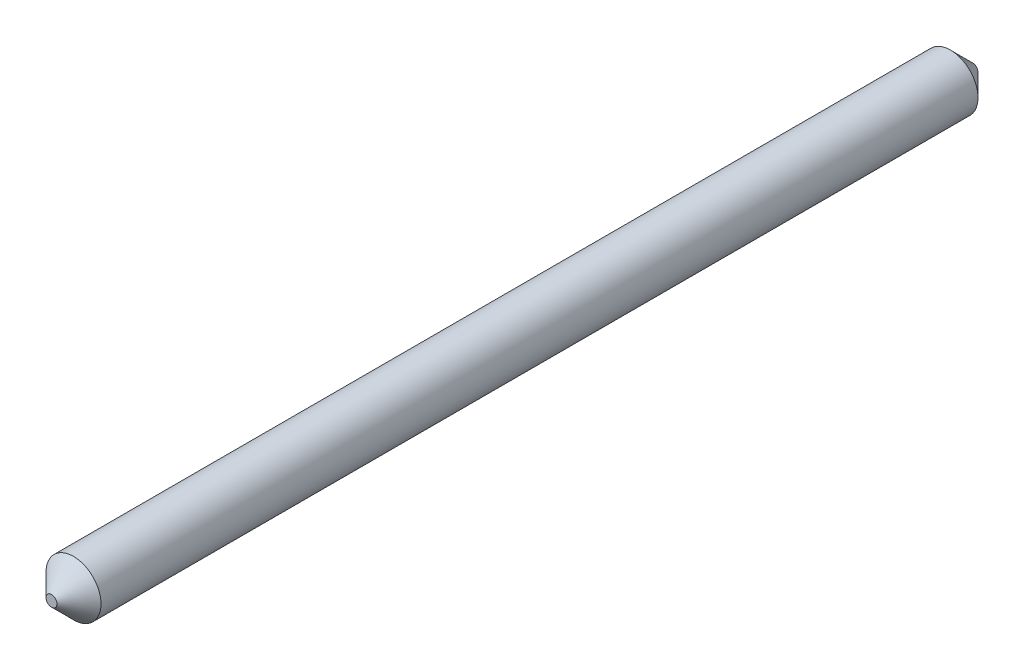
ISO-10303-21;
HEADER;
FILE_DESCRIPTION(('STEP AP214'),'2;1');
FILE_NAME('part.step','',(''),(''),'','','');
FILE_SCHEMA(('AUTOMOTIVE_DESIGN { 1 0 10303 214 1 1 1 1 }'));
ENDSEC;
DATA;
#1=APPLICATION_CONTEXT('core data for automotive mechanical design processes');
#2=APPLICATION_PROTOCOL_DEFINITION('international standard','automotive_design',2000,#1);
#3=PRODUCT_CONTEXT('',#1,'mechanical');
#4=PRODUCT('Part','Part','',(#3));
#5=PRODUCT_RELATED_PRODUCT_CATEGORY('part','',(#4));
#6=PRODUCT_DEFINITION_FORMATION('','',#4);
#7=PRODUCT_DEFINITION_CONTEXT('part definition',#1,'design');
#8=PRODUCT_DEFINITION('design','',#6,#7);
#9=PRODUCT_DEFINITION_SHAPE('','',#8);
#10=(LENGTH_UNIT() NAMED_UNIT(*) SI_UNIT(.MILLI.,.METRE.));
#11=(NAMED_UNIT(*) PLANE_ANGLE_UNIT() SI_UNIT($,.RADIAN.));
#12=(NAMED_UNIT(*) SI_UNIT($,.STERADIAN.) SOLID_ANGLE_UNIT());
#13=UNCERTAINTY_MEASURE_WITH_UNIT(LENGTH_MEASURE(1.E-05),#10,'distance_accuracy_value','');
#14=(GEOMETRIC_REPRESENTATION_CONTEXT(3) GLOBAL_UNCERTAINTY_ASSIGNED_CONTEXT((#13)) GLOBAL_UNIT_ASSIGNED_CONTEXT((#10,
#11,#12)) REPRESENTATION_CONTEXT('',''));
#15=CARTESIAN_POINT('',(0.,0.,0.));
#16=DIRECTION('',(0.,0.,1.));
#17=DIRECTION('',(1.,0.,0.));
#18=AXIS2_PLACEMENT_3D('',#15,#16,#17);
#19=CARTESIAN_POINT('',(0.,0.,4.52));
#20=DIRECTION('',(0.,0.,1.));
#21=DIRECTION('',(1.,0.,0.));
#22=AXIS2_PLACEMENT_3D('',#19,#20,#21);
#23=PLANE('',#22);
#24=CARTESIAN_POINT('',(0.,0.,4.52));
#25=DIRECTION('',(0.,0.,1.));
#26=DIRECTION('',(1.,0.,0.));
#27=AXIS2_PLACEMENT_3D('',#24,#25,#26);
#28=CIRCLE('',#27,0.046);
#29=CARTESIAN_POINT('',(0.046,0.,4.52));
#30=VERTEX_POINT('',#29);
#31=EDGE_CURVE('E11',#30,#30,#28,.T.);
#32=ORIENTED_EDGE('',*,*,#31,.T.);
#33=EDGE_LOOP('',(#32));
#34=FACE_BOUND('',#33,.T.);
#35=ADVANCED_FACE('F17',(#34),#23,.T.);
#36=CARTESIAN_POINT('',(0.,0.,-3.18));
#37=DIRECTION('',(0.,0.,1.));
#38=DIRECTION('',(1.,0.,0.));
#39=AXIS2_PLACEMENT_3D('',#36,#37,#38);
#40=PLANE('',#39);
#41=CARTESIAN_POINT('',(0.,0.,-3.18));
#42=DIRECTION('',(0.,0.,1.));
#43=DIRECTION('',(1.,0.,0.));
#44=AXIS2_PLACEMENT_3D('',#41,#42,#43);
#45=CIRCLE('',#44,0.046);
#46=CARTESIAN_POINT('',(0.046,0.,-3.18));
#47=VERTEX_POINT('',#46);
#48=EDGE_CURVE('E55',#47,#47,#45,.T.);
#49=ORIENTED_EDGE('',*,*,#48,.F.);
#50=EDGE_LOOP('',(#49));
#51=FACE_BOUND('',#50,.T.);
#52=ADVANCED_FACE('F82',(#51),#40,.F.);
#53=CARTESIAN_POINT('',(0.,0.,4.336));
#54=DIRECTION('',(0.,0.,-1.));
#55=DIRECTION('',(1.,0.,0.));
#56=AXIS2_PLACEMENT_3D('',#53,#54,#55);
#57=CONICAL_SURFACE('',#56,0.23,0.785398163397);
#58=DIRECTION('',(-0.707106781186548,0.,0.707106781186548));
#59=VECTOR('',#58,1.);
#60=CARTESIAN_POINT('',(0.23,0.,4.336));
#61=LINE('',#60,#59);
#62=CARTESIAN_POINT('',(0.23,0.,4.336));
#63=VERTEX_POINT('',#62);
#64=EDGE_CURVE('E25',#63,#30,#61,.T.);
#65=ORIENTED_EDGE('',*,*,#64,.F.);
#66=CARTESIAN_POINT('',(0.,0.,4.336));
#67=DIRECTION('',(0.,0.,1.));
#68=DIRECTION('',(1.,0.,0.));
#69=AXIS2_PLACEMENT_3D('',#66,#67,#68);
#70=CIRCLE('',#69,0.23);
#71=EDGE_CURVE('E64',#63,#63,#70,.T.);
#72=ORIENTED_EDGE('',*,*,#71,.T.);
#73=ORIENTED_EDGE('',*,*,#64,.T.);
#74=ORIENTED_EDGE('',*,*,#31,.F.);
#75=EDGE_LOOP('',(#65,#72,#73,#74));
#76=FACE_BOUND('',#75,.T.);
#77=ADVANCED_FACE('F80',(#76),#57,.T.);
#78=CARTESIAN_POINT('',(0.,0.,-2.996));
#79=DIRECTION('',(0.,0.,1.));
#80=DIRECTION('',(1.,0.,0.));
#81=AXIS2_PLACEMENT_3D('',#78,#79,#80);
#82=CONICAL_SURFACE('',#81,0.23,0.785398163397);
#83=ORIENTED_EDGE('',*,*,#48,.T.);
#84=DIRECTION('',(-0.707106781186548,0.,-0.707106781186548));
#85=VECTOR('',#84,1.);
#86=CARTESIAN_POINT('',(0.23,0.,-2.996));
#87=LINE('',#86,#85);
#88=CARTESIAN_POINT('',(0.23,0.,-2.996));
#89=VERTEX_POINT('',#88);
#90=EDGE_CURVE('E42',#89,#47,#87,.T.);
#91=ORIENTED_EDGE('',*,*,#90,.F.);
#92=CARTESIAN_POINT('',(0.,0.,-2.996));
#93=DIRECTION('',(0.,0.,1.));
#94=DIRECTION('',(1.,0.,0.));
#95=AXIS2_PLACEMENT_3D('',#92,#93,#94);
#96=CIRCLE('',#95,0.23);
#97=EDGE_CURVE('E52',#89,#89,#96,.T.);
#98=ORIENTED_EDGE('',*,*,#97,.F.);
#99=ORIENTED_EDGE('',*,*,#90,.T.);
#100=EDGE_LOOP('',(#83,#91,#98,#99));
#101=FACE_BOUND('',#100,.T.);
#102=ADVANCED_FACE('F51',(#101),#82,.T.);
#103=CARTESIAN_POINT('',(0.,0.,-3.18));
#104=DIRECTION('',(0.,0.,1.));
#105=DIRECTION('',(1.,0.,0.));
#106=AXIS2_PLACEMENT_3D('',#103,#104,#105);
#107=CYLINDRICAL_SURFACE('',#106,0.23);
#108=DIRECTION('',(0.,0.,1.));
#109=VECTOR('',#108,1.);
#110=CARTESIAN_POINT('',(0.23,0.,-3.18));
#111=LINE('',#110,#109);
#112=EDGE_CURVE('E62',#89,#63,#111,.T.);
#113=ORIENTED_EDGE('',*,*,#112,.T.);
#114=ORIENTED_EDGE('',*,*,#71,.F.);
#115=ORIENTED_EDGE('',*,*,#112,.F.);
#116=ORIENTED_EDGE('',*,*,#97,.T.);
#117=EDGE_LOOP('',(#113,#114,#115,#116));
#118=FACE_BOUND('',#117,.T.);
#119=ADVANCED_FACE('F60',(#118),#107,.T.);
#120=CLOSED_SHELL('',(#35,#52,#77,#102,#119));
#121=MANIFOLD_SOLID_BREP('B1',#120);
#122=ADVANCED_BREP_SHAPE_REPRESENTATION('',(#18,#121),#14);
#123=SHAPE_DEFINITION_REPRESENTATION(#9,#122);
ENDSEC;
END-ISO-10303-21;
